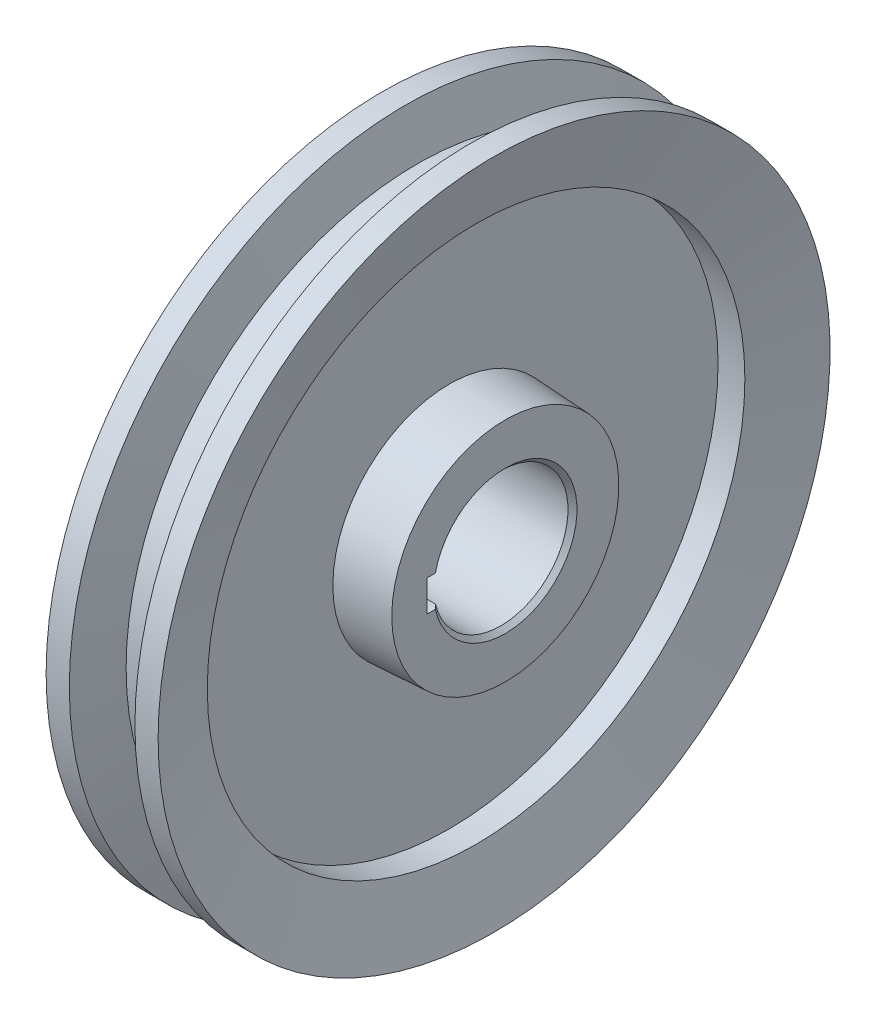
ISO-10303-21;
HEADER;
FILE_DESCRIPTION(('STEP AP214'),'2;1');
FILE_NAME('part.step','',(''),(''),'','','');
FILE_SCHEMA(('AUTOMOTIVE_DESIGN { 1 0 10303 214 1 1 1 1 }'));
ENDSEC;
DATA;
#1=APPLICATION_CONTEXT('core data for automotive mechanical design processes');
#2=APPLICATION_PROTOCOL_DEFINITION('international standard','automotive_design',2000,#1);
#3=PRODUCT_CONTEXT('',#1,'mechanical');
#4=PRODUCT('Part','Part','',(#3));
#5=PRODUCT_RELATED_PRODUCT_CATEGORY('part','',(#4));
#6=PRODUCT_DEFINITION_FORMATION('','',#4);
#7=PRODUCT_DEFINITION_CONTEXT('part definition',#1,'design');
#8=PRODUCT_DEFINITION('design','',#6,#7);
#9=PRODUCT_DEFINITION_SHAPE('','',#8);
#10=(LENGTH_UNIT() NAMED_UNIT(*) SI_UNIT(.MILLI.,.METRE.));
#11=(NAMED_UNIT(*) PLANE_ANGLE_UNIT() SI_UNIT($,.RADIAN.));
#12=(NAMED_UNIT(*) SI_UNIT($,.STERADIAN.) SOLID_ANGLE_UNIT());
#13=UNCERTAINTY_MEASURE_WITH_UNIT(LENGTH_MEASURE(1.E-05),#10,'distance_accuracy_value','');
#14=(GEOMETRIC_REPRESENTATION_CONTEXT(3) GLOBAL_UNCERTAINTY_ASSIGNED_CONTEXT((#13)) GLOBAL_UNIT_ASSIGNED_CONTEXT((#10,
#11,#12)) REPRESENTATION_CONTEXT('',''));
#15=CARTESIAN_POINT('',(0.,0.,0.));
#16=DIRECTION('',(0.,0.,1.));
#17=DIRECTION('',(1.,0.,0.));
#18=AXIS2_PLACEMENT_3D('',#15,#16,#17);
#19=CARTESIAN_POINT('',(0.,0.,0.));
#20=DIRECTION('',(-1.,0.,0.));
#21=DIRECTION('',(0.,0.,1.));
#22=AXIS2_PLACEMENT_3D('',#19,#20,#21);
#23=CYLINDRICAL_SURFACE('',#22,15.);
#24=DIRECTION('',(1.,0.,0.));
#25=VECTOR('',#24,1.);
#26=CARTESIAN_POINT('',(-15.,3.5,14.5859521458148));
#27=LINE('',#26,#25);
#28=CARTESIAN_POINT('',(-14.,3.5,14.5859521458148));
#29=VERTEX_POINT('',#28);
#30=CARTESIAN_POINT('',(14.,3.5,14.5859521458148));
#31=VERTEX_POINT('',#30);
#32=EDGE_CURVE('E115',#29,#31,#27,.T.);
#33=ORIENTED_EDGE('',*,*,#32,.F.);
#34=CARTESIAN_POINT('',(-14.,0.,0.));
#35=DIRECTION('',(1.,0.,0.));
#36=DIRECTION('',(0.,0.,-1.));
#37=AXIS2_PLACEMENT_3D('',#34,#35,#36);
#38=CIRCLE('',#37,15.);
#39=CARTESIAN_POINT('',(-14.,-3.5,14.5859521458148));
#40=VERTEX_POINT('',#39);
#41=EDGE_CURVE('E224',#29,#40,#38,.F.);
#42=ORIENTED_EDGE('',*,*,#41,.T.);
#43=DIRECTION('',(1.,0.,0.));
#44=VECTOR('',#43,1.);
#45=CARTESIAN_POINT('',(-15.,-3.5,14.5859521458148));
#46=LINE('',#45,#44);
#47=CARTESIAN_POINT('',(14.,-3.5,14.5859521458148));
#48=VERTEX_POINT('',#47);
#49=EDGE_CURVE('E109',#40,#48,#46,.T.);
#50=ORIENTED_EDGE('',*,*,#49,.T.);
#51=CARTESIAN_POINT('',(14.,0.,0.));
#52=DIRECTION('',(-1.,0.,0.));
#53=DIRECTION('',(0.,0.,1.));
#54=AXIS2_PLACEMENT_3D('',#51,#52,#53);
#55=CIRCLE('',#54,15.);
#56=EDGE_CURVE('E208',#48,#31,#55,.F.);
#57=ORIENTED_EDGE('',*,*,#56,.T.);
#58=EDGE_LOOP('',(#33,#42,#50,#57));
#59=FACE_BOUND('',#58,.T.);
#60=ADVANCED_FACE('F39',(#59),#23,.F.);
#61=CARTESIAN_POINT('',(15.,15.,0.));
#62=DIRECTION('',(-1.,0.,0.));
#63=DIRECTION('',(0.,0.,1.));
#64=AXIS2_PLACEMENT_3D('',#61,#62,#63);
#65=PLANE('',#64);
#66=CARTESIAN_POINT('',(15.,0.,0.));
#67=DIRECTION('',(-1.,0.,0.));
#68=DIRECTION('',(0.,0.,1.));
#69=AXIS2_PLACEMENT_3D('',#66,#67,#68);
#70=CIRCLE('',#69,25.344902758962);
#71=CARTESIAN_POINT('',(15.,0.,25.344902758962));
#72=VERTEX_POINT('',#71);
#73=EDGE_CURVE('E191',#72,#72,#70,.T.);
#74=ORIENTED_EDGE('',*,*,#73,.F.);
#75=EDGE_LOOP('',(#74));
#76=FACE_BOUND('',#75,.T.);
#77=DIRECTION('',(0.,0.,1.));
#78=VECTOR('',#77,1.);
#79=CARTESIAN_POINT('',(15.,3.5,14.5859521458148));
#80=LINE('',#79,#78);
#81=CARTESIAN_POINT('',(15.,3.5,15.612494995996));
#82=VERTEX_POINT('',#81);
#83=CARTESIAN_POINT('',(15.,3.5,17.5));
#84=VERTEX_POINT('',#83);
#85=EDGE_CURVE('E126',#82,#84,#80,.T.);
#86=ORIENTED_EDGE('',*,*,#85,.F.);
#87=CARTESIAN_POINT('',(15.,0.,0.));
#88=DIRECTION('',(-1.,0.,0.));
#89=DIRECTION('',(0.,0.,1.));
#90=AXIS2_PLACEMENT_3D('',#87,#88,#89);
#91=CIRCLE('',#90,16.);
#92=CARTESIAN_POINT('',(15.,-3.5,15.612494995996));
#93=VERTEX_POINT('',#92);
#94=EDGE_CURVE('E195',#82,#93,#91,.T.);
#95=ORIENTED_EDGE('',*,*,#94,.T.);
#96=DIRECTION('',(0.,0.,-1.));
#97=VECTOR('',#96,1.);
#98=CARTESIAN_POINT('',(15.,-3.5,17.5));
#99=LINE('',#98,#97);
#100=CARTESIAN_POINT('',(15.,-3.5,17.5));
#101=VERTEX_POINT('',#100);
#102=EDGE_CURVE('E123',#101,#93,#99,.T.);
#103=ORIENTED_EDGE('',*,*,#102,.F.);
#104=DIRECTION('',(0.,-1.,0.));
#105=VECTOR('',#104,1.);
#106=CARTESIAN_POINT('',(15.,3.5,17.5));
#107=LINE('',#106,#105);
#108=EDGE_CURVE('E105',#84,#101,#107,.T.);
#109=ORIENTED_EDGE('',*,*,#108,.F.);
#110=EDGE_LOOP('',(#86,#95,#103,#109));
#111=FACE_BOUND('',#110,.T.);
#112=ADVANCED_FACE('F243',(#76,#111),#65,.F.);
#113=CARTESIAN_POINT('',(15.,0.,0.));
#114=DIRECTION('',(-1.,0.,0.));
#115=DIRECTION('',(0.,0.,1.));
#116=AXIS2_PLACEMENT_3D('',#113,#114,#115);
#117=CONICAL_SURFACE('',#116,25.344902758962,0.0523598775598305);
#118=CARTESIAN_POINT('',(2.50000000000001,0.,0.));
#119=DIRECTION('',(-1.,0.,0.));
#120=DIRECTION('',(0.,0.,1.));
#121=AXIS2_PLACEMENT_3D('',#118,#119,#120);
#122=CIRCLE('',#121,26.);
#123=CARTESIAN_POINT('',(2.50000000000001,0.,26.));
#124=VERTEX_POINT('',#123);
#125=EDGE_CURVE('E187',#124,#124,#122,.T.);
#126=ORIENTED_EDGE('',*,*,#125,.F.);
#127=EDGE_LOOP('',(#126));
#128=FACE_BOUND('',#127,.T.);
#129=ORIENTED_EDGE('',*,*,#73,.T.);
#130=EDGE_LOOP('',(#129));
#131=FACE_BOUND('',#130,.T.);
#132=ADVANCED_FACE('F245',(#128,#131),#117,.T.);
#133=CARTESIAN_POINT('',(2.50000000000001,26.,0.));
#134=DIRECTION('',(-1.,0.,0.));
#135=DIRECTION('',(0.,0.,1.));
#136=AXIS2_PLACEMENT_3D('',#133,#134,#135);
#137=PLANE('',#136);
#138=CARTESIAN_POINT('',(2.50000000000001,0.,0.));
#139=DIRECTION('',(-1.,0.,0.));
#140=DIRECTION('',(0.,0.,1.));
#141=AXIS2_PLACEMENT_3D('',#138,#139,#140);
#142=CIRCLE('',#141,60.);
#143=CARTESIAN_POINT('',(2.50000000000001,0.,60.));
#144=VERTEX_POINT('',#143);
#145=EDGE_CURVE('E183',#144,#144,#142,.T.);
#146=ORIENTED_EDGE('',*,*,#145,.F.);
#147=EDGE_LOOP('',(#146));
#148=FACE_BOUND('',#147,.T.);
#149=ORIENTED_EDGE('',*,*,#125,.T.);
#150=EDGE_LOOP('',(#149));
#151=FACE_BOUND('',#150,.T.);
#152=ADVANCED_FACE('F252',(#148,#151),#137,.F.);
#153=CARTESIAN_POINT('',(0.,0.,0.));
#154=DIRECTION('',(-1.,0.,0.));
#155=DIRECTION('',(0.,0.,1.));
#156=AXIS2_PLACEMENT_3D('',#153,#154,#155);
#157=CYLINDRICAL_SURFACE('',#156,60.);
#158=CARTESIAN_POINT('',(8.48076211353315,0.,0.));
#159=DIRECTION('',(-1.,0.,0.));
#160=DIRECTION('',(0.,0.,1.));
#161=AXIS2_PLACEMENT_3D('',#158,#159,#160);
#162=CIRCLE('',#161,60.);
#163=CARTESIAN_POINT('',(8.48076211353315,0.,60.));
#164=VERTEX_POINT('',#163);
#165=EDGE_CURVE('E179',#164,#164,#162,.T.);
#166=ORIENTED_EDGE('',*,*,#165,.F.);
#167=EDGE_LOOP('',(#166));
#168=FACE_BOUND('',#167,.T.);
#169=ORIENTED_EDGE('',*,*,#145,.T.);
#170=EDGE_LOOP('',(#169));
#171=FACE_BOUND('',#170,.T.);
#172=ADVANCED_FACE('F259',(#168,#171),#157,.F.);
#173=CARTESIAN_POINT('',(8.48076211353315,0.,0.));
#174=DIRECTION('',(1.,0.,0.));
#175=DIRECTION('',(0.,0.,-1.));
#176=AXIS2_PLACEMENT_3D('',#173,#174,#175);
#177=CONICAL_SURFACE('',#176,60.,1.30899693899575);
#178=CARTESIAN_POINT('',(12.5,0.,0.));
#179=DIRECTION('',(-1.,0.,0.));
#180=DIRECTION('',(0.,0.,1.));
#181=AXIS2_PLACEMENT_3D('',#178,#179,#180);
#182=CIRCLE('',#181,75.);
#183=CARTESIAN_POINT('',(12.5,0.,75.));
#184=VERTEX_POINT('',#183);
#185=EDGE_CURVE('E175',#184,#184,#182,.T.);
#186=ORIENTED_EDGE('',*,*,#185,.F.);
#187=EDGE_LOOP('',(#186));
#188=FACE_BOUND('',#187,.T.);
#189=ORIENTED_EDGE('',*,*,#165,.T.);
#190=EDGE_LOOP('',(#189));
#191=FACE_BOUND('',#190,.T.);
#192=ADVANCED_FACE('F263',(#188,#191),#177,.F.);
#193=CARTESIAN_POINT('',(0.,0.,0.));
#194=DIRECTION('',(-1.,0.,0.));
#195=DIRECTION('',(0.,0.,1.));
#196=AXIS2_PLACEMENT_3D('',#193,#194,#195);
#197=CYLINDRICAL_SURFACE('',#196,75.);
#198=CARTESIAN_POINT('',(7.32361909794959,0.,0.));
#199=DIRECTION('',(-1.,0.,0.));
#200=DIRECTION('',(0.,0.,1.));
#201=AXIS2_PLACEMENT_3D('',#198,#199,#200);
#202=CIRCLE('',#201,75.);
#203=CARTESIAN_POINT('',(7.32361909794959,0.,75.));
#204=VERTEX_POINT('',#203);
#205=EDGE_CURVE('E171',#204,#204,#202,.T.);
#206=ORIENTED_EDGE('',*,*,#205,.F.);
#207=EDGE_LOOP('',(#206));
#208=FACE_BOUND('',#207,.T.);
#209=ORIENTED_EDGE('',*,*,#185,.T.);
#210=EDGE_LOOP('',(#209));
#211=FACE_BOUND('',#210,.T.);
#212=ADVANCED_FACE('F267',(#208,#211),#197,.T.);
#213=CARTESIAN_POINT('',(7.32361909794959,0.,0.));
#214=DIRECTION('',(1.,0.,0.));
#215=DIRECTION('',(0.,0.,-1.));
#216=AXIS2_PLACEMENT_3D('',#213,#214,#215);
#217=CONICAL_SURFACE('',#216,75.,1.30899693899575);
#218=CARTESIAN_POINT('',(4.64412717363835,0.,0.));
#219=DIRECTION('',(-1.,0.,0.));
#220=DIRECTION('',(0.,0.,1.));
#221=AXIS2_PLACEMENT_3D('',#218,#219,#220);
#222=CIRCLE('',#221,65.);
#223=CARTESIAN_POINT('',(4.64412717363835,0.,65.));
#224=VERTEX_POINT('',#223);
#225=EDGE_CURVE('E167',#224,#224,#222,.T.);
#226=ORIENTED_EDGE('',*,*,#225,.F.);
#227=EDGE_LOOP('',(#226));
#228=FACE_BOUND('',#227,.T.);
#229=ORIENTED_EDGE('',*,*,#205,.T.);
#230=EDGE_LOOP('',(#229));
#231=FACE_BOUND('',#230,.T.);
#232=ADVANCED_FACE('F271',(#228,#231),#217,.T.);
#233=CARTESIAN_POINT('',(0.,0.,0.));
#234=DIRECTION('',(-1.,0.,0.));
#235=DIRECTION('',(0.,0.,1.));
#236=AXIS2_PLACEMENT_3D('',#233,#234,#235);
#237=CYLINDRICAL_SURFACE('',#236,65.);
#238=CARTESIAN_POINT('',(-4.64412717363834,0.,0.));
#239=DIRECTION('',(-1.,0.,0.));
#240=DIRECTION('',(0.,0.,1.));
#241=AXIS2_PLACEMENT_3D('',#238,#239,#240);
#242=CIRCLE('',#241,65.);
#243=CARTESIAN_POINT('',(-4.64412717363834,0.,65.));
#244=VERTEX_POINT('',#243);
#245=EDGE_CURVE('E163',#244,#244,#242,.T.);
#246=ORIENTED_EDGE('',*,*,#245,.F.);
#247=EDGE_LOOP('',(#246));
#248=FACE_BOUND('',#247,.T.);
#249=ORIENTED_EDGE('',*,*,#225,.T.);
#250=EDGE_LOOP('',(#249));
#251=FACE_BOUND('',#250,.T.);
#252=ADVANCED_FACE('F275',(#248,#251),#237,.T.);
#253=CARTESIAN_POINT('',(-4.64412717363834,0.,0.));
#254=DIRECTION('',(-1.,0.,0.));
#255=DIRECTION('',(0.,0.,1.));
#256=AXIS2_PLACEMENT_3D('',#253,#254,#255);
#257=CONICAL_SURFACE('',#256,65.,1.30899693899575);
#258=CARTESIAN_POINT('',(-7.32361909794958,0.,0.));
#259=DIRECTION('',(-1.,0.,0.));
#260=DIRECTION('',(0.,0.,1.));
#261=AXIS2_PLACEMENT_3D('',#258,#259,#260);
#262=CIRCLE('',#261,75.);
#263=CARTESIAN_POINT('',(-7.32361909794958,0.,75.));
#264=VERTEX_POINT('',#263);
#265=EDGE_CURVE('E159',#264,#264,#262,.T.);
#266=ORIENTED_EDGE('',*,*,#265,.F.);
#267=EDGE_LOOP('',(#266));
#268=FACE_BOUND('',#267,.T.);
#269=ORIENTED_EDGE('',*,*,#245,.T.);
#270=EDGE_LOOP('',(#269));
#271=FACE_BOUND('',#270,.T.);
#272=ADVANCED_FACE('F279',(#268,#271),#257,.T.);
#273=CARTESIAN_POINT('',(0.,0.,0.));
#274=DIRECTION('',(-1.,0.,0.));
#275=DIRECTION('',(0.,0.,1.));
#276=AXIS2_PLACEMENT_3D('',#273,#274,#275);
#277=CYLINDRICAL_SURFACE('',#276,75.);
#278=CARTESIAN_POINT('',(-12.5,0.,0.));
#279=DIRECTION('',(-1.,0.,0.));
#280=DIRECTION('',(0.,0.,1.));
#281=AXIS2_PLACEMENT_3D('',#278,#279,#280);
#282=CIRCLE('',#281,75.);
#283=CARTESIAN_POINT('',(-12.5,0.,75.));
#284=VERTEX_POINT('',#283);
#285=EDGE_CURVE('E155',#284,#284,#282,.T.);
#286=ORIENTED_EDGE('',*,*,#285,.F.);
#287=EDGE_LOOP('',(#286));
#288=FACE_BOUND('',#287,.T.);
#289=ORIENTED_EDGE('',*,*,#265,.T.);
#290=EDGE_LOOP('',(#289));
#291=FACE_BOUND('',#290,.T.);
#292=ADVANCED_FACE('F283',(#288,#291),#277,.T.);
#293=CARTESIAN_POINT('',(-12.5,0.,0.));
#294=DIRECTION('',(-1.,0.,0.));
#295=DIRECTION('',(0.,0.,1.));
#296=AXIS2_PLACEMENT_3D('',#293,#294,#295);
#297=CONICAL_SURFACE('',#296,75.,1.30899693899575);
#298=CARTESIAN_POINT('',(-8.48076211353314,0.,0.));
#299=DIRECTION('',(-1.,0.,0.));
#300=DIRECTION('',(0.,0.,1.));
#301=AXIS2_PLACEMENT_3D('',#298,#299,#300);
#302=CIRCLE('',#301,60.);
#303=CARTESIAN_POINT('',(-8.48076211353314,0.,60.));
#304=VERTEX_POINT('',#303);
#305=EDGE_CURVE('E151',#304,#304,#302,.T.);
#306=ORIENTED_EDGE('',*,*,#305,.F.);
#307=EDGE_LOOP('',(#306));
#308=FACE_BOUND('',#307,.T.);
#309=ORIENTED_EDGE('',*,*,#285,.T.);
#310=EDGE_LOOP('',(#309));
#311=FACE_BOUND('',#310,.T.);
#312=ADVANCED_FACE('F287',(#308,#311),#297,.F.);
#313=CARTESIAN_POINT('',(0.,0.,0.));
#314=DIRECTION('',(-1.,0.,0.));
#315=DIRECTION('',(0.,0.,1.));
#316=AXIS2_PLACEMENT_3D('',#313,#314,#315);
#317=CYLINDRICAL_SURFACE('',#316,60.);
#318=CARTESIAN_POINT('',(-2.5,0.,0.));
#319=DIRECTION('',(-1.,0.,0.));
#320=DIRECTION('',(0.,0.,1.));
#321=AXIS2_PLACEMENT_3D('',#318,#319,#320);
#322=CIRCLE('',#321,60.);
#323=CARTESIAN_POINT('',(-2.5,0.,60.));
#324=VERTEX_POINT('',#323);
#325=EDGE_CURVE('E147',#324,#324,#322,.T.);
#326=ORIENTED_EDGE('',*,*,#325,.F.);
#327=EDGE_LOOP('',(#326));
#328=FACE_BOUND('',#327,.T.);
#329=ORIENTED_EDGE('',*,*,#305,.T.);
#330=EDGE_LOOP('',(#329));
#331=FACE_BOUND('',#330,.T.);
#332=ADVANCED_FACE('F291',(#328,#331),#317,.F.);
#333=CARTESIAN_POINT('',(-2.5,26.,0.));
#334=DIRECTION('',(1.,0.,0.));
#335=DIRECTION('',(0.,0.,-1.));
#336=AXIS2_PLACEMENT_3D('',#333,#334,#335);
#337=PLANE('',#336);
#338=CARTESIAN_POINT('',(-2.49999999999999,0.,0.));
#339=DIRECTION('',(-1.,0.,0.));
#340=DIRECTION('',(0.,0.,1.));
#341=AXIS2_PLACEMENT_3D('',#338,#339,#340);
#342=CIRCLE('',#341,26.);
#343=CARTESIAN_POINT('',(-2.49999999999999,0.,26.));
#344=VERTEX_POINT('',#343);
#345=EDGE_CURVE('E143',#344,#344,#342,.T.);
#346=ORIENTED_EDGE('',*,*,#345,.F.);
#347=EDGE_LOOP('',(#346));
#348=FACE_BOUND('',#347,.T.);
#349=ORIENTED_EDGE('',*,*,#325,.T.);
#350=EDGE_LOOP('',(#349));
#351=FACE_BOUND('',#350,.T.);
#352=ADVANCED_FACE('F295',(#348,#351),#337,.F.);
#353=CARTESIAN_POINT('',(-2.49999999999999,0.,0.));
#354=DIRECTION('',(1.,0.,0.));
#355=DIRECTION('',(0.,0.,-1.));
#356=AXIS2_PLACEMENT_3D('',#353,#354,#355);
#357=CONICAL_SURFACE('',#356,26.,0.0523598775598308);
#358=CARTESIAN_POINT('',(-15.,0.,0.));
#359=DIRECTION('',(-1.,0.,0.));
#360=DIRECTION('',(0.,0.,1.));
#361=AXIS2_PLACEMENT_3D('',#358,#359,#360);
#362=CIRCLE('',#361,25.344902758962);
#363=CARTESIAN_POINT('',(-15.,0.,25.344902758962));
#364=VERTEX_POINT('',#363);
#365=EDGE_CURVE('E134',#364,#364,#362,.T.);
#366=ORIENTED_EDGE('',*,*,#365,.F.);
#367=EDGE_LOOP('',(#366));
#368=FACE_BOUND('',#367,.T.);
#369=ORIENTED_EDGE('',*,*,#345,.T.);
#370=EDGE_LOOP('',(#369));
#371=FACE_BOUND('',#370,.T.);
#372=ADVANCED_FACE('F299',(#368,#371),#357,.T.);
#373=CARTESIAN_POINT('',(-15.,15.,0.));
#374=DIRECTION('',(1.,0.,0.));
#375=DIRECTION('',(0.,0.,-1.));
#376=AXIS2_PLACEMENT_3D('',#373,#374,#375);
#377=PLANE('',#376);
#378=DIRECTION('',(0.,0.,-1.));
#379=VECTOR('',#378,1.);
#380=CARTESIAN_POINT('',(-15.,-3.5,17.5));
#381=LINE('',#380,#379);
#382=CARTESIAN_POINT('',(-15.,-3.5,17.5));
#383=VERTEX_POINT('',#382);
#384=CARTESIAN_POINT('',(-15.,-3.5,15.612494995996));
#385=VERTEX_POINT('',#384);
#386=EDGE_CURVE('E112',#383,#385,#381,.T.);
#387=ORIENTED_EDGE('',*,*,#386,.T.);
#388=CARTESIAN_POINT('',(-15.,0.,0.));
#389=DIRECTION('',(1.,0.,0.));
#390=DIRECTION('',(0.,0.,-1.));
#391=AXIS2_PLACEMENT_3D('',#388,#389,#390);
#392=CIRCLE('',#391,16.);
#393=CARTESIAN_POINT('',(-15.,3.5,15.612494995996));
#394=VERTEX_POINT('',#393);
#395=EDGE_CURVE('E54',#385,#394,#392,.T.);
#396=ORIENTED_EDGE('',*,*,#395,.T.);
#397=DIRECTION('',(0.,0.,1.));
#398=VECTOR('',#397,1.);
#399=CARTESIAN_POINT('',(-15.,3.5,14.5859521458148));
#400=LINE('',#399,#398);
#401=CARTESIAN_POINT('',(-15.,3.5,17.5));
#402=VERTEX_POINT('',#401);
#403=EDGE_CURVE('E119',#394,#402,#400,.T.);
#404=ORIENTED_EDGE('',*,*,#403,.T.);
#405=DIRECTION('',(0.,-1.,0.));
#406=VECTOR('',#405,1.);
#407=CARTESIAN_POINT('',(-15.,3.5,17.5));
#408=LINE('',#407,#406);
#409=EDGE_CURVE('E102',#402,#383,#408,.T.);
#410=ORIENTED_EDGE('',*,*,#409,.T.);
#411=EDGE_LOOP('',(#387,#396,#404,#410));
#412=FACE_BOUND('',#411,.T.);
#413=ORIENTED_EDGE('',*,*,#365,.T.);
#414=EDGE_LOOP('',(#413));
#415=FACE_BOUND('',#414,.T.);
#416=ADVANCED_FACE('F117',(#412,#415),#377,.F.);
#417=CARTESIAN_POINT('',(-15.,-3.5,17.5));
#418=DIRECTION('',(0.,-1.,0.));
#419=DIRECTION('',(0.,0.,-1.));
#420=AXIS2_PLACEMENT_3D('',#417,#418,#419);
#421=PLANE('',#420);
#422=ORIENTED_EDGE('',*,*,#49,.F.);
#423=CARTESIAN_POINT('',(-14.,-3.5,14.5859521458148));
#424=CARTESIAN_POINT('',(-14.1665182831403,-3.5,14.757187169709));
#425=CARTESIAN_POINT('',(-14.3331107585497,-3.5,14.9283499196897));
#426=CARTESIAN_POINT('',(-14.6664440918849,-3.5,15.2705308697483));
#427=CARTESIAN_POINT('',(-14.8331849498087,-3.5,15.441549069828));
#428=CARTESIAN_POINT('',(-15.,-3.5,15.612494995996));
#429=B_SPLINE_CURVE_WITH_KNOTS('',3,(#423,#424,#425,#426,#427,#428),.UNSPECIFIED.,.F.,.F.,(4,2,
4),(0.,0.716552620953931,1.43310523321437),.UNSPECIFIED.);
#430=EDGE_CURVE('E68',#40,#385,#429,.T.);
#431=ORIENTED_EDGE('',*,*,#430,.T.);
#432=ORIENTED_EDGE('',*,*,#386,.F.);
#433=DIRECTION('',(1.,0.,0.));
#434=VECTOR('',#433,1.);
#435=CARTESIAN_POINT('',(-15.,-3.5,17.5));
#436=LINE('',#435,#434);
#437=EDGE_CURVE('E98',#383,#101,#436,.T.);
#438=ORIENTED_EDGE('',*,*,#437,.T.);
#439=ORIENTED_EDGE('',*,*,#102,.T.);
#440=CARTESIAN_POINT('',(15.,-3.5,15.612494995996));
#441=CARTESIAN_POINT('',(14.8331849498088,-3.5,15.441549069828));
#442=CARTESIAN_POINT('',(14.6664440918849,-3.5,15.2705308697483));
#443=CARTESIAN_POINT('',(14.3331107585497,-3.5,14.9283499196897));
#444=CARTESIAN_POINT('',(14.1665182831403,-3.5,14.757187169709));
#445=CARTESIAN_POINT('',(14.,-3.5,14.5859521458148));
#446=B_SPLINE_CURVE_WITH_KNOTS('',3,(#440,#441,#442,#443,#444,#445),.UNSPECIFIED.,.F.,.F.,(4,2,
4),(0.,0.716552612260447,1.43310523321438),.UNSPECIFIED.);
#447=EDGE_CURVE('E199',#93,#48,#446,.T.);
#448=ORIENTED_EDGE('',*,*,#447,.T.);
#449=EDGE_LOOP('',(#422,#431,#432,#438,#439,#448));
#450=FACE_BOUND('',#449,.T.);
#451=ADVANCED_FACE('F113',(#450),#421,.F.);
#452=CARTESIAN_POINT('',(-15.,3.5,17.5));
#453=DIRECTION('',(0.,0.,1.));
#454=DIRECTION('',(1.,0.,0.));
#455=AXIS2_PLACEMENT_3D('',#452,#453,#454);
#456=PLANE('',#455);
#457=ORIENTED_EDGE('',*,*,#108,.T.);
#458=ORIENTED_EDGE('',*,*,#437,.F.);
#459=ORIENTED_EDGE('',*,*,#409,.F.);
#460=DIRECTION('',(1.,0.,0.));
#461=VECTOR('',#460,1.);
#462=CARTESIAN_POINT('',(-15.,3.5,17.5));
#463=LINE('',#462,#461);
#464=EDGE_CURVE('E110',#402,#84,#463,.T.);
#465=ORIENTED_EDGE('',*,*,#464,.T.);
#466=EDGE_LOOP('',(#457,#458,#459,#465));
#467=FACE_BOUND('',#466,.T.);
#468=ADVANCED_FACE('F99',(#467),#456,.F.);
#469=CARTESIAN_POINT('',(-15.,3.5,14.5859521458148));
#470=DIRECTION('',(0.,1.,0.));
#471=DIRECTION('',(0.,0.,1.));
#472=AXIS2_PLACEMENT_3D('',#469,#470,#471);
#473=PLANE('',#472);
#474=ORIENTED_EDGE('',*,*,#403,.F.);
#475=CARTESIAN_POINT('',(-15.,3.5,15.612494995996));
#476=CARTESIAN_POINT('',(-14.8331849498087,3.5,15.441549069828));
#477=CARTESIAN_POINT('',(-14.6664440918849,3.5,15.2705308697483));
#478=CARTESIAN_POINT('',(-14.3331107585497,3.5,14.9283499196897));
#479=CARTESIAN_POINT('',(-14.1665182831403,3.5,14.757187169709));
#480=CARTESIAN_POINT('',(-14.,3.5,14.5859521458148));
#481=B_SPLINE_CURVE_WITH_KNOTS('',3,(#475,#476,#477,#478,#479,#480),.UNSPECIFIED.,.F.,.F.,(4,2,
4),(0.,0.716552612260442,1.43310523321437),.UNSPECIFIED.);
#482=EDGE_CURVE('E11',#394,#29,#481,.T.);
#483=ORIENTED_EDGE('',*,*,#482,.T.);
#484=ORIENTED_EDGE('',*,*,#32,.T.);
#485=CARTESIAN_POINT('',(14.,3.5,14.5859521458148));
#486=CARTESIAN_POINT('',(14.1665182831403,3.5,14.757187169709));
#487=CARTESIAN_POINT('',(14.3331107585497,3.5,14.9283499196897));
#488=CARTESIAN_POINT('',(14.6664440918849,3.5,15.2705308697483));
#489=CARTESIAN_POINT('',(14.8331849498088,3.5,15.441549069828));
#490=CARTESIAN_POINT('',(15.,3.5,15.612494995996));
#491=B_SPLINE_CURVE_WITH_KNOTS('',3,(#485,#486,#487,#488,#489,#490),.UNSPECIFIED.,.F.,.F.,(4,2,
4),(0.,0.716552620953935,1.43310523321438),.UNSPECIFIED.);
#492=EDGE_CURVE('E229',#31,#82,#491,.T.);
#493=ORIENTED_EDGE('',*,*,#492,.T.);
#494=ORIENTED_EDGE('',*,*,#85,.T.);
#495=ORIENTED_EDGE('',*,*,#464,.F.);
#496=EDGE_LOOP('',(#474,#483,#484,#493,#494,#495));
#497=FACE_BOUND('',#496,.T.);
#498=ADVANCED_FACE('F241',(#497),#473,.F.);
#499=CARTESIAN_POINT('',(15.,0.,0.));
#500=DIRECTION('',(1.,0.,0.));
#501=DIRECTION('',(0.,0.,-1.));
#502=AXIS2_PLACEMENT_3D('',#499,#500,#501);
#503=CONICAL_SURFACE('',#502,16.,0.785398163397446);
#504=ORIENTED_EDGE('',*,*,#492,.F.);
#505=ORIENTED_EDGE('',*,*,#56,.F.);
#506=ORIENTED_EDGE('',*,*,#447,.F.);
#507=ORIENTED_EDGE('',*,*,#94,.F.);
#508=EDGE_LOOP('',(#504,#505,#506,#507));
#509=FACE_BOUND('',#508,.T.);
#510=ADVANCED_FACE('F210',(#509),#503,.F.);
#511=CARTESIAN_POINT('',(-14.,0.,0.));
#512=DIRECTION('',(-1.,0.,0.));
#513=DIRECTION('',(0.,0.,1.));
#514=AXIS2_PLACEMENT_3D('',#511,#512,#513);
#515=CONICAL_SURFACE('',#514,15.,0.78539816339745);
#516=ORIENTED_EDGE('',*,*,#482,.F.);
#517=ORIENTED_EDGE('',*,*,#395,.F.);
#518=ORIENTED_EDGE('',*,*,#430,.F.);
#519=ORIENTED_EDGE('',*,*,#41,.F.);
#520=EDGE_LOOP('',(#516,#517,#518,#519));
#521=FACE_BOUND('',#520,.T.);
#522=ADVANCED_FACE('F41',(#521),#515,.F.);
#523=CLOSED_SHELL('',(#60,#112,#132,#152,#172,#192,#212,#232,#252,#272,#292,#312,#332,#352,#372,
#416,#451,#468,#498,#510,#522));
#524=MANIFOLD_SOLID_BREP('B2',#523);
#525=ADVANCED_BREP_SHAPE_REPRESENTATION('',(#18,#524),#14);
#526=SHAPE_DEFINITION_REPRESENTATION(#9,#525);
ENDSEC;
END-ISO-10303-21;
